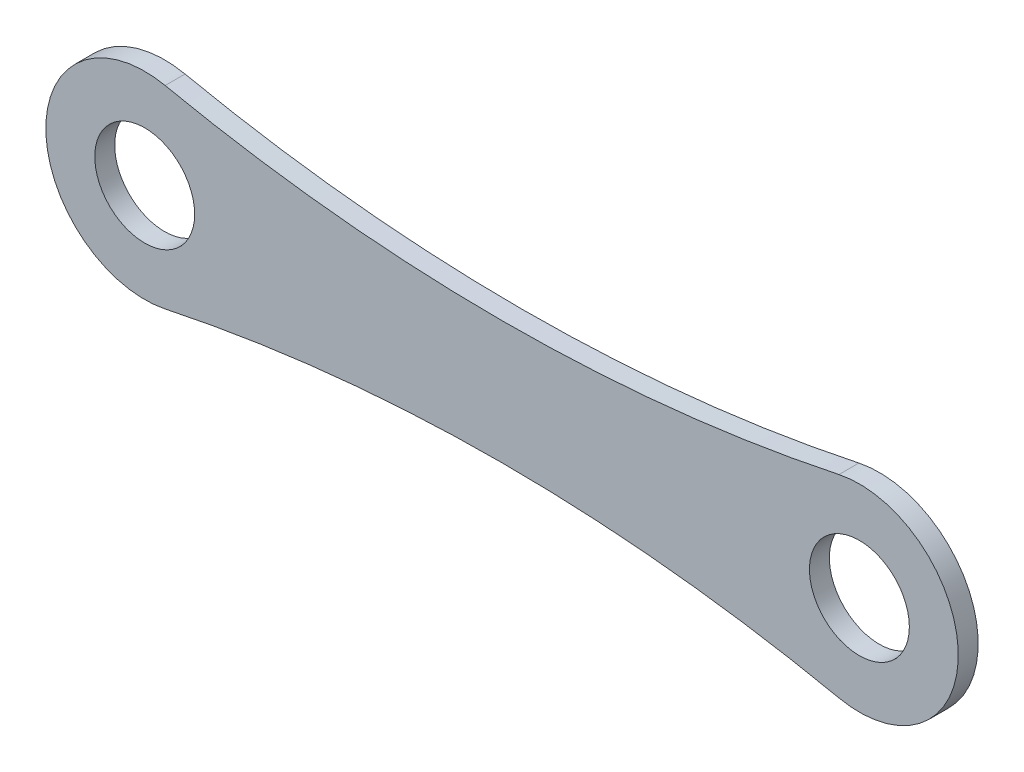
ISO-10303-21;
HEADER;
FILE_DESCRIPTION(('STEP AP214'),'2;1');
FILE_NAME('part.step','',(''),(''),'','','');
FILE_SCHEMA(('AUTOMOTIVE_DESIGN { 1 0 10303 214 1 1 1 1 }'));
ENDSEC;
DATA;
#1=APPLICATION_CONTEXT('core data for automotive mechanical design processes');
#2=APPLICATION_PROTOCOL_DEFINITION('international standard','automotive_design',2000,#1);
#3=PRODUCT_CONTEXT('',#1,'mechanical');
#4=PRODUCT('Part','Part','',(#3));
#5=PRODUCT_RELATED_PRODUCT_CATEGORY('part','',(#4));
#6=PRODUCT_DEFINITION_FORMATION('','',#4);
#7=PRODUCT_DEFINITION_CONTEXT('part definition',#1,'design');
#8=PRODUCT_DEFINITION('design','',#6,#7);
#9=PRODUCT_DEFINITION_SHAPE('','',#8);
#10=(LENGTH_UNIT() NAMED_UNIT(*) SI_UNIT(.MILLI.,.METRE.));
#11=(NAMED_UNIT(*) PLANE_ANGLE_UNIT() SI_UNIT($,.RADIAN.));
#12=(NAMED_UNIT(*) SI_UNIT($,.STERADIAN.) SOLID_ANGLE_UNIT());
#13=UNCERTAINTY_MEASURE_WITH_UNIT(LENGTH_MEASURE(1.E-05),#10,'distance_accuracy_value','');
#14=(GEOMETRIC_REPRESENTATION_CONTEXT(3) GLOBAL_UNCERTAINTY_ASSIGNED_CONTEXT((#13)) GLOBAL_UNIT_ASSIGNED_CONTEXT((#10,
#11,#12)) REPRESENTATION_CONTEXT('',''));
#15=CARTESIAN_POINT('',(0.,0.,0.));
#16=DIRECTION('',(0.,0.,1.));
#17=DIRECTION('',(1.,0.,0.));
#18=AXIS2_PLACEMENT_3D('',#15,#16,#17);
#19=CARTESIAN_POINT('',(0.,0.,-1.588));
#20=DIRECTION('',(0.,0.,-1.));
#21=DIRECTION('',(1.,0.,0.));
#22=AXIS2_PLACEMENT_3D('',#19,#20,#21);
#23=PLANE('',#22);
#24=CARTESIAN_POINT('',(0.,0.,-1.588));
#25=DIRECTION('',(0.,0.,1.));
#26=DIRECTION('',(1.,0.,0.));
#27=AXIS2_PLACEMENT_3D('',#24,#25,#26);
#28=CIRCLE('',#27,3.985);
#29=CARTESIAN_POINT('',(3.985,0.,-1.588));
#30=VERTEX_POINT('',#29);
#31=EDGE_CURVE('E188',#30,#30,#28,.T.);
#32=ORIENTED_EDGE('',*,*,#31,.T.);
#33=EDGE_LOOP('',(#32));
#34=FACE_BOUND('',#33,.T.);
#35=CARTESIAN_POINT('',(0.,0.,-1.588));
#36=DIRECTION('',(0.,0.,1.));
#37=DIRECTION('',(1.,0.,0.));
#38=AXIS2_PLACEMENT_3D('',#35,#36,#37);
#39=CIRCLE('',#38,7.89);
#40=CARTESIAN_POINT('',(-1.63132859525709,-7.7195120969072,-1.588));
#41=VERTEX_POINT('',#40);
#42=CARTESIAN_POINT('',(-1.63132859525709,7.71951209690719,-1.588));
#43=VERTEX_POINT('',#42);
#44=EDGE_CURVE('E191',#41,#43,#39,.T.);
#45=ORIENTED_EDGE('',*,*,#44,.F.);
#46=CARTESIAN_POINT('',(-28.51,-134.910459194237,-1.588));
#47=DIRECTION('',(0.,0.,1.));
#48=DIRECTION('',(1.,0.,0.));
#49=AXIS2_PLACEMENT_3D('',#46,#47,#48);
#50=CIRCLE('',#49,130.);
#51=CARTESIAN_POINT('',(-55.3886714047429,-7.71951209690719,-1.588));
#52=VERTEX_POINT('',#51);
#53=EDGE_CURVE('E199',#41,#52,#50,.T.);
#54=ORIENTED_EDGE('',*,*,#53,.T.);
#55=CARTESIAN_POINT('',(-57.02,0.,-1.588));
#56=DIRECTION('',(0.,0.,1.));
#57=DIRECTION('',(1.,0.,0.));
#58=AXIS2_PLACEMENT_3D('',#55,#56,#57);
#59=CIRCLE('',#58,7.89);
#60=CARTESIAN_POINT('',(-55.3886714047429,7.71951209690719,-1.588));
#61=VERTEX_POINT('',#60);
#62=EDGE_CURVE('E196',#61,#52,#59,.T.);
#63=ORIENTED_EDGE('',*,*,#62,.F.);
#64=CARTESIAN_POINT('',(-28.51,134.910459194237,-1.588));
#65=DIRECTION('',(0.,0.,1.));
#66=DIRECTION('',(1.,0.,0.));
#67=AXIS2_PLACEMENT_3D('',#64,#65,#66);
#68=CIRCLE('',#67,130.);
#69=EDGE_CURVE('E194',#43,#61,#68,.F.);
#70=ORIENTED_EDGE('',*,*,#69,.F.);
#71=EDGE_LOOP('',(#45,#54,#63,#70));
#72=FACE_BOUND('',#71,.T.);
#73=CARTESIAN_POINT('',(-57.02,0.,-1.588));
#74=DIRECTION('',(0.,0.,1.));
#75=DIRECTION('',(1.,0.,0.));
#76=AXIS2_PLACEMENT_3D('',#73,#74,#75);
#77=CIRCLE('',#76,3.985);
#78=CARTESIAN_POINT('',(-53.035,0.,-1.588));
#79=VERTEX_POINT('',#78);
#80=EDGE_CURVE('E202',#79,#79,#77,.T.);
#81=ORIENTED_EDGE('',*,*,#80,.T.);
#82=EDGE_LOOP('',(#81));
#83=FACE_BOUND('',#82,.T.);
#84=DIRECTION('',(-1.,0.,0.));
#85=VECTOR('',#84,1.);
#86=CARTESIAN_POINT('',(-47.8578537610848,-2.24163128163509,-1.588));
#87=LINE('',#86,#85);
#88=CARTESIAN_POINT('',(-47.8578537610848,-2.24163128163509,-1.588));
#89=VERTEX_POINT('',#88);
#90=CARTESIAN_POINT('',(-48.4860588892899,-2.24163128163509,-1.588));
#91=VERTEX_POINT('',#90);
#92=EDGE_CURVE('E174',#89,#91,#87,.T.);
#93=ORIENTED_EDGE('',*,*,#92,.F.);
#94=DIRECTION('',(0.,-1.,0.));
#95=VECTOR('',#94,1.);
#96=CARTESIAN_POINT('',(-47.8578537610848,-0.671118461122265,-1.588));
#97=LINE('',#96,#95);
#98=CARTESIAN_POINT('',(-47.8578537610848,-0.671118461122265,-1.588));
#99=VERTEX_POINT('',#98);
#100=EDGE_CURVE('E264',#99,#89,#97,.T.);
#101=ORIENTED_EDGE('',*,*,#100,.F.);
#102=DIRECTION('',(-1.,0.,0.));
#103=VECTOR('',#102,1.);
#104=CARTESIAN_POINT('',(-46.7809306841617,-0.671118461122265,-1.588));
#105=LINE('',#104,#103);
#106=CARTESIAN_POINT('',(-46.7809306841617,-0.671118461122265,-1.588));
#107=VERTEX_POINT('',#106);
#108=EDGE_CURVE('E267',#107,#99,#105,.T.);
#109=ORIENTED_EDGE('',*,*,#108,.F.);
#110=DIRECTION('',(0.,-1.,0.));
#111=VECTOR('',#110,1.);
#112=CARTESIAN_POINT('',(-46.7809306841617,-0.0429133329171365,-1.588));
#113=LINE('',#112,#111);
#114=CARTESIAN_POINT('',(-46.7809306841617,-0.0429133329171365,-1.588));
#115=VERTEX_POINT('',#114);
#116=EDGE_CURVE('E310',#115,#107,#113,.T.);
#117=ORIENTED_EDGE('',*,*,#116,.F.);
#118=DIRECTION('',(1.,0.,0.));
#119=VECTOR('',#118,1.);
#120=CARTESIAN_POINT('',(-47.8578537610848,-0.0429133329171365,-1.588));
#121=LINE('',#120,#119);
#122=CARTESIAN_POINT('',(-47.8578537610848,-0.0429133329171365,-1.588));
#123=VERTEX_POINT('',#122);
#124=EDGE_CURVE('E304',#123,#115,#121,.T.);
#125=ORIENTED_EDGE('',*,*,#124,.F.);
#126=DIRECTION('',(0.,-1.,0.));
#127=VECTOR('',#126,1.);
#128=CARTESIAN_POINT('',(-47.8578537610848,0.630163590159787,-1.588));
#129=LINE('',#128,#127);
#130=CARTESIAN_POINT('',(-47.8578537610848,0.630163590159787,-1.588));
#131=VERTEX_POINT('',#130);
#132=EDGE_CURVE('E302',#131,#123,#129,.T.);
#133=ORIENTED_EDGE('',*,*,#132,.F.);
#134=DIRECTION('',(-1.,0.,0.));
#135=VECTOR('',#134,1.);
#136=CARTESIAN_POINT('',(-46.7809306841617,0.630163590159787,-1.588));
#137=LINE('',#136,#135);
#138=CARTESIAN_POINT('',(-46.7809306841617,0.630163590159787,-1.588));
#139=VERTEX_POINT('',#138);
#140=EDGE_CURVE('E290',#139,#131,#137,.T.);
#141=ORIENTED_EDGE('',*,*,#140,.F.);
#142=DIRECTION('',(0.,-1.,0.));
#143=VECTOR('',#142,1.);
#144=CARTESIAN_POINT('',(-46.7809306841617,1.25836871836491,-1.588));
#145=LINE('',#144,#143);
#146=CARTESIAN_POINT('',(-46.7809306841617,1.25836871836491,-1.588));
#147=VERTEX_POINT('',#146);
#148=EDGE_CURVE('E296',#147,#139,#145,.T.);
#149=ORIENTED_EDGE('',*,*,#148,.F.);
#150=DIRECTION('',(1.,0.,0.));
#151=VECTOR('',#150,1.);
#152=CARTESIAN_POINT('',(-48.4860588892899,1.25836871836491,-1.588));
#153=LINE('',#152,#151);
#154=CARTESIAN_POINT('',(-48.4860588892899,1.25836871836491,-1.588));
#155=VERTEX_POINT('',#154);
#156=EDGE_CURVE('E298',#155,#147,#153,.T.);
#157=ORIENTED_EDGE('',*,*,#156,.F.);
#158=DIRECTION('',(0.,1.,0.));
#159=VECTOR('',#158,1.);
#160=CARTESIAN_POINT('',(-48.4860588892899,-2.24163128163509,-1.588));
#161=LINE('',#160,#159);
#162=EDGE_CURVE('E177',#91,#155,#161,.T.);
#163=ORIENTED_EDGE('',*,*,#162,.F.);
#164=EDGE_LOOP('',(#93,#101,#109,#117,#125,#133,#141,#149,#157,#163));
#165=FACE_BOUND('',#164,.T.);
#166=ADVANCED_FACE('F47',(#34,#72,#83,#165),#23,.T.);
#167=CARTESIAN_POINT('',(0.,0.,-1.588));
#168=DIRECTION('',(0.,0.,1.));
#169=DIRECTION('',(-1.,0.,0.));
#170=AXIS2_PLACEMENT_3D('',#167,#168,#169);
#171=CYLINDRICAL_SURFACE('',#170,7.89);
#172=CARTESIAN_POINT('',(0.,0.,0.));
#173=DIRECTION('',(0.,0.,1.));
#174=DIRECTION('',(1.,0.,0.));
#175=AXIS2_PLACEMENT_3D('',#172,#173,#174);
#176=CIRCLE('',#175,7.89);
#177=CARTESIAN_POINT('',(-1.63132859525709,-7.7195120969072,0.));
#178=VERTEX_POINT('',#177);
#179=CARTESIAN_POINT('',(-1.63132859525709,7.71951209690719,0.));
#180=VERTEX_POINT('',#179);
#181=EDGE_CURVE('E182',#178,#180,#176,.T.);
#182=ORIENTED_EDGE('',*,*,#181,.F.);
#183=DIRECTION('',(0.,0.,1.));
#184=VECTOR('',#183,1.);
#185=CARTESIAN_POINT('',(-1.63132859525709,-7.7195120969072,-1.588));
#186=LINE('',#185,#184);
#187=EDGE_CURVE('E71',#41,#178,#186,.T.);
#188=ORIENTED_EDGE('',*,*,#187,.F.);
#189=ORIENTED_EDGE('',*,*,#44,.T.);
#190=DIRECTION('',(0.,0.,1.));
#191=VECTOR('',#190,1.);
#192=CARTESIAN_POINT('',(-1.63132859525709,7.71951209690719,-1.588));
#193=LINE('',#192,#191);
#194=EDGE_CURVE('E11',#43,#180,#193,.T.);
#195=ORIENTED_EDGE('',*,*,#194,.T.);
#196=EDGE_LOOP('',(#182,#188,#189,#195));
#197=FACE_BOUND('',#196,.T.);
#198=ADVANCED_FACE('F223',(#197),#171,.T.);
#199=CARTESIAN_POINT('',(-28.51,134.910459194237,-1.588));
#200=DIRECTION('',(0.,0.,1.));
#201=DIRECTION('',(-1.,0.,0.));
#202=AXIS2_PLACEMENT_3D('',#199,#200,#201);
#203=CYLINDRICAL_SURFACE('',#202,130.);
#204=CARTESIAN_POINT('',(-28.51,134.910459194237,0.));
#205=DIRECTION('',(0.,0.,1.));
#206=DIRECTION('',(1.,0.,0.));
#207=AXIS2_PLACEMENT_3D('',#204,#205,#206);
#208=CIRCLE('',#207,130.);
#209=CARTESIAN_POINT('',(-55.3886714047429,7.71951209690719,0.));
#210=VERTEX_POINT('',#209);
#211=EDGE_CURVE('E206',#180,#210,#208,.F.);
#212=ORIENTED_EDGE('',*,*,#211,.F.);
#213=ORIENTED_EDGE('',*,*,#194,.F.);
#214=ORIENTED_EDGE('',*,*,#69,.T.);
#215=DIRECTION('',(0.,0.,1.));
#216=VECTOR('',#215,1.);
#217=CARTESIAN_POINT('',(-55.3886714047429,7.71951209690719,-1.588));
#218=LINE('',#217,#216);
#219=EDGE_CURVE('E55',#61,#210,#218,.T.);
#220=ORIENTED_EDGE('',*,*,#219,.T.);
#221=EDGE_LOOP('',(#212,#213,#214,#220));
#222=FACE_BOUND('',#221,.T.);
#223=ADVANCED_FACE('F218',(#222),#203,.F.);
#224=CARTESIAN_POINT('',(-57.02,0.,-1.588));
#225=DIRECTION('',(0.,0.,1.));
#226=DIRECTION('',(-1.,0.,0.));
#227=AXIS2_PLACEMENT_3D('',#224,#225,#226);
#228=CYLINDRICAL_SURFACE('',#227,7.89);
#229=CARTESIAN_POINT('',(-57.02,0.,0.));
#230=DIRECTION('',(0.,0.,1.));
#231=DIRECTION('',(1.,0.,0.));
#232=AXIS2_PLACEMENT_3D('',#229,#230,#231);
#233=CIRCLE('',#232,7.89);
#234=CARTESIAN_POINT('',(-55.3886714047429,-7.71951209690719,0.));
#235=VERTEX_POINT('',#234);
#236=EDGE_CURVE('E209',#210,#235,#233,.T.);
#237=ORIENTED_EDGE('',*,*,#236,.F.);
#238=ORIENTED_EDGE('',*,*,#219,.F.);
#239=ORIENTED_EDGE('',*,*,#62,.T.);
#240=DIRECTION('',(0.,0.,1.));
#241=VECTOR('',#240,1.);
#242=CARTESIAN_POINT('',(-55.3886714047429,-7.71951209690719,-1.588));
#243=LINE('',#242,#241);
#244=EDGE_CURVE('E215',#52,#235,#243,.T.);
#245=ORIENTED_EDGE('',*,*,#244,.T.);
#246=EDGE_LOOP('',(#237,#238,#239,#245));
#247=FACE_BOUND('',#246,.T.);
#248=ADVANCED_FACE('F227',(#247),#228,.T.);
#249=CARTESIAN_POINT('',(-28.51,-134.910459194237,-1.588));
#250=DIRECTION('',(0.,0.,1.));
#251=DIRECTION('',(-1.,0.,0.));
#252=AXIS2_PLACEMENT_3D('',#249,#250,#251);
#253=CYLINDRICAL_SURFACE('',#252,130.);
#254=CARTESIAN_POINT('',(-28.51,-134.910459194237,0.));
#255=DIRECTION('',(0.,0.,1.));
#256=DIRECTION('',(1.,0.,0.));
#257=AXIS2_PLACEMENT_3D('',#254,#255,#256);
#258=CIRCLE('',#257,130.);
#259=EDGE_CURVE('E93',#178,#235,#258,.T.);
#260=ORIENTED_EDGE('',*,*,#259,.T.);
#261=ORIENTED_EDGE('',*,*,#244,.F.);
#262=ORIENTED_EDGE('',*,*,#53,.F.);
#263=ORIENTED_EDGE('',*,*,#187,.T.);
#264=EDGE_LOOP('',(#260,#261,#262,#263));
#265=FACE_BOUND('',#264,.T.);
#266=ADVANCED_FACE('F229',(#265),#253,.F.);
#267=CARTESIAN_POINT('',(0.,0.,-1.588));
#268=DIRECTION('',(0.,0.,1.));
#269=DIRECTION('',(-1.,0.,0.));
#270=AXIS2_PLACEMENT_3D('',#267,#268,#269);
#271=CYLINDRICAL_SURFACE('',#270,3.985);
#272=ORIENTED_EDGE('',*,*,#31,.F.);
#273=EDGE_LOOP('',(#272));
#274=FACE_BOUND('',#273,.T.);
#275=CARTESIAN_POINT('',(0.,0.,0.));
#276=DIRECTION('',(0.,0.,1.));
#277=DIRECTION('',(1.,0.,0.));
#278=AXIS2_PLACEMENT_3D('',#275,#276,#277);
#279=CIRCLE('',#278,3.985);
#280=CARTESIAN_POINT('',(3.985,0.,0.));
#281=VERTEX_POINT('',#280);
#282=EDGE_CURVE('E179',#281,#281,#279,.T.);
#283=ORIENTED_EDGE('',*,*,#282,.T.);
#284=EDGE_LOOP('',(#283));
#285=FACE_BOUND('',#284,.T.);
#286=ADVANCED_FACE('F49',(#274,#285),#271,.F.);
#287=CARTESIAN_POINT('',(-57.02,0.,-1.588));
#288=DIRECTION('',(0.,0.,1.));
#289=DIRECTION('',(-1.,0.,0.));
#290=AXIS2_PLACEMENT_3D('',#287,#288,#289);
#291=CYLINDRICAL_SURFACE('',#290,3.985);
#292=ORIENTED_EDGE('',*,*,#80,.F.);
#293=EDGE_LOOP('',(#292));
#294=FACE_BOUND('',#293,.T.);
#295=CARTESIAN_POINT('',(-57.02,0.,0.));
#296=DIRECTION('',(0.,0.,1.));
#297=DIRECTION('',(1.,0.,0.));
#298=AXIS2_PLACEMENT_3D('',#295,#296,#297);
#299=CIRCLE('',#298,3.985);
#300=CARTESIAN_POINT('',(-53.035,0.,0.));
#301=VERTEX_POINT('',#300);
#302=EDGE_CURVE('E192',#301,#301,#299,.T.);
#303=ORIENTED_EDGE('',*,*,#302,.T.);
#304=EDGE_LOOP('',(#303));
#305=FACE_BOUND('',#304,.T.);
#306=ADVANCED_FACE('F236',(#294,#305),#291,.F.);
#307=CARTESIAN_POINT('',(0.,0.,0.));
#308=DIRECTION('',(0.,0.,-1.));
#309=DIRECTION('',(1.,0.,0.));
#310=AXIS2_PLACEMENT_3D('',#307,#308,#309);
#311=PLANE('',#310);
#312=ORIENTED_EDGE('',*,*,#282,.F.);
#313=EDGE_LOOP('',(#312));
#314=FACE_BOUND('',#313,.T.);
#315=ORIENTED_EDGE('',*,*,#181,.T.);
#316=ORIENTED_EDGE('',*,*,#211,.T.);
#317=ORIENTED_EDGE('',*,*,#236,.T.);
#318=ORIENTED_EDGE('',*,*,#259,.F.);
#319=EDGE_LOOP('',(#315,#316,#317,#318));
#320=FACE_BOUND('',#319,.T.);
#321=ORIENTED_EDGE('',*,*,#302,.F.);
#322=EDGE_LOOP('',(#321));
#323=FACE_BOUND('',#322,.T.);
#324=ADVANCED_FACE('F221',(#314,#320,#323),#311,.F.);
#325=CARTESIAN_POINT('',(-48.4860588892899,-2.24163128163509,-1.288));
#326=DIRECTION('',(1.,0.,0.));
#327=DIRECTION('',(0.,0.,1.));
#328=AXIS2_PLACEMENT_3D('',#325,#326,#327);
#329=PLANE('',#328);
#330=ORIENTED_EDGE('',*,*,#162,.T.);
#331=DIRECTION('',(0.,0.,-1.));
#332=VECTOR('',#331,1.);
#333=CARTESIAN_POINT('',(-48.4860588892899,1.25836871836491,-1.288));
#334=LINE('',#333,#332);
#335=CARTESIAN_POINT('',(-48.4860588892899,1.25836871836491,-1.288));
#336=VERTEX_POINT('',#335);
#337=EDGE_CURVE('E164',#336,#155,#334,.T.);
#338=ORIENTED_EDGE('',*,*,#337,.F.);
#339=DIRECTION('',(0.,1.,0.));
#340=VECTOR('',#339,1.);
#341=CARTESIAN_POINT('',(-48.4860588892899,-2.24163128163509,-1.288));
#342=LINE('',#341,#340);
#343=CARTESIAN_POINT('',(-48.4860588892899,-2.24163128163509,-1.288));
#344=VERTEX_POINT('',#343);
#345=EDGE_CURVE('E169',#344,#336,#342,.T.);
#346=ORIENTED_EDGE('',*,*,#345,.F.);
#347=DIRECTION('',(0.,0.,-1.));
#348=VECTOR('',#347,1.);
#349=CARTESIAN_POINT('',(-48.4860588892899,-2.24163128163509,-1.288));
#350=LINE('',#349,#348);
#351=EDGE_CURVE('E62',#344,#91,#350,.T.);
#352=ORIENTED_EDGE('',*,*,#351,.T.);
#353=EDGE_LOOP('',(#330,#338,#346,#352));
#354=FACE_BOUND('',#353,.T.);
#355=ADVANCED_FACE('F176',(#354),#329,.T.);
#356=CARTESIAN_POINT('',(-48.4860588892899,1.25836871836491,-1.288));
#357=DIRECTION('',(0.,-1.,0.));
#358=DIRECTION('',(0.,0.,1.));
#359=AXIS2_PLACEMENT_3D('',#356,#357,#358);
#360=PLANE('',#359);
#361=ORIENTED_EDGE('',*,*,#156,.T.);
#362=DIRECTION('',(0.,0.,-1.));
#363=VECTOR('',#362,1.);
#364=CARTESIAN_POINT('',(-46.7809306841617,1.25836871836491,-1.288));
#365=LINE('',#364,#363);
#366=CARTESIAN_POINT('',(-46.7809306841617,1.25836871836491,-1.288));
#367=VERTEX_POINT('',#366);
#368=EDGE_CURVE('E165',#367,#147,#365,.T.);
#369=ORIENTED_EDGE('',*,*,#368,.F.);
#370=DIRECTION('',(1.,0.,0.));
#371=VECTOR('',#370,1.);
#372=CARTESIAN_POINT('',(-48.4860588892899,1.25836871836491,-1.288));
#373=LINE('',#372,#371);
#374=EDGE_CURVE('E159',#336,#367,#373,.T.);
#375=ORIENTED_EDGE('',*,*,#374,.F.);
#376=ORIENTED_EDGE('',*,*,#337,.T.);
#377=EDGE_LOOP('',(#361,#369,#375,#376));
#378=FACE_BOUND('',#377,.T.);
#379=ADVANCED_FACE('F162',(#378),#360,.T.);
#380=CARTESIAN_POINT('',(-46.7809306841617,1.25836871836491,-1.288));
#381=DIRECTION('',(-1.,0.,0.));
#382=DIRECTION('',(0.,0.,-1.));
#383=AXIS2_PLACEMENT_3D('',#380,#381,#382);
#384=PLANE('',#383);
#385=ORIENTED_EDGE('',*,*,#148,.T.);
#386=DIRECTION('',(0.,0.,-1.));
#387=VECTOR('',#386,1.);
#388=CARTESIAN_POINT('',(-46.7809306841617,0.630163590159787,-1.288));
#389=LINE('',#388,#387);
#390=CARTESIAN_POINT('',(-46.7809306841617,0.630163590159787,-1.288));
#391=VERTEX_POINT('',#390);
#392=EDGE_CURVE('E184',#391,#139,#389,.T.);
#393=ORIENTED_EDGE('',*,*,#392,.F.);
#394=DIRECTION('',(0.,-1.,0.));
#395=VECTOR('',#394,1.);
#396=CARTESIAN_POINT('',(-46.7809306841617,1.25836871836491,-1.288));
#397=LINE('',#396,#395);
#398=EDGE_CURVE('E168',#367,#391,#397,.T.);
#399=ORIENTED_EDGE('',*,*,#398,.F.);
#400=ORIENTED_EDGE('',*,*,#368,.T.);
#401=EDGE_LOOP('',(#385,#393,#399,#400));
#402=FACE_BOUND('',#401,.T.);
#403=ADVANCED_FACE('F297',(#402),#384,.T.);
#404=CARTESIAN_POINT('',(-46.7809306841617,0.630163590159787,-1.288));
#405=DIRECTION('',(0.,1.,0.));
#406=DIRECTION('',(0.,0.,-1.));
#407=AXIS2_PLACEMENT_3D('',#404,#405,#406);
#408=PLANE('',#407);
#409=ORIENTED_EDGE('',*,*,#140,.T.);
#410=DIRECTION('',(0.,0.,-1.));
#411=VECTOR('',#410,1.);
#412=CARTESIAN_POINT('',(-47.8578537610848,0.630163590159787,-1.288));
#413=LINE('',#412,#411);
#414=CARTESIAN_POINT('',(-47.8578537610848,0.630163590159787,-1.288));
#415=VERTEX_POINT('',#414);
#416=EDGE_CURVE('E282',#415,#131,#413,.T.);
#417=ORIENTED_EDGE('',*,*,#416,.F.);
#418=DIRECTION('',(-1.,0.,0.));
#419=VECTOR('',#418,1.);
#420=CARTESIAN_POINT('',(-46.7809306841617,0.630163590159787,-1.288));
#421=LINE('',#420,#419);
#422=EDGE_CURVE('E293',#391,#415,#421,.T.);
#423=ORIENTED_EDGE('',*,*,#422,.F.);
#424=ORIENTED_EDGE('',*,*,#392,.T.);
#425=EDGE_LOOP('',(#409,#417,#423,#424));
#426=FACE_BOUND('',#425,.T.);
#427=ADVANCED_FACE('F287',(#426),#408,.T.);
#428=CARTESIAN_POINT('',(-47.8578537610848,0.630163590159787,-1.288));
#429=DIRECTION('',(-1.,0.,0.));
#430=DIRECTION('',(0.,0.,-1.));
#431=AXIS2_PLACEMENT_3D('',#428,#429,#430);
#432=PLANE('',#431);
#433=ORIENTED_EDGE('',*,*,#132,.T.);
#434=DIRECTION('',(0.,0.,-1.));
#435=VECTOR('',#434,1.);
#436=CARTESIAN_POINT('',(-47.8578537610848,-0.0429133329171365,-1.288));
#437=LINE('',#436,#435);
#438=CARTESIAN_POINT('',(-47.8578537610848,-0.0429133329171365,-1.288));
#439=VERTEX_POINT('',#438);
#440=EDGE_CURVE('E280',#439,#123,#437,.T.);
#441=ORIENTED_EDGE('',*,*,#440,.F.);
#442=DIRECTION('',(0.,-1.,0.));
#443=VECTOR('',#442,1.);
#444=CARTESIAN_POINT('',(-47.8578537610848,0.630163590159787,-1.288));
#445=LINE('',#444,#443);
#446=EDGE_CURVE('E331',#415,#439,#445,.T.);
#447=ORIENTED_EDGE('',*,*,#446,.F.);
#448=ORIENTED_EDGE('',*,*,#416,.T.);
#449=EDGE_LOOP('',(#433,#441,#447,#448));
#450=FACE_BOUND('',#449,.T.);
#451=ADVANCED_FACE('F330',(#450),#432,.T.);
#452=CARTESIAN_POINT('',(-47.8578537610848,-0.0429133329171365,-1.288));
#453=DIRECTION('',(0.,-1.,0.));
#454=DIRECTION('',(0.,0.,1.));
#455=AXIS2_PLACEMENT_3D('',#452,#453,#454);
#456=PLANE('',#455);
#457=ORIENTED_EDGE('',*,*,#124,.T.);
#458=DIRECTION('',(0.,0.,-1.));
#459=VECTOR('',#458,1.);
#460=CARTESIAN_POINT('',(-46.7809306841617,-0.0429133329171365,-1.288));
#461=LINE('',#460,#459);
#462=CARTESIAN_POINT('',(-46.7809306841617,-0.0429133329171365,-1.288));
#463=VERTEX_POINT('',#462);
#464=EDGE_CURVE('E278',#463,#115,#461,.T.);
#465=ORIENTED_EDGE('',*,*,#464,.F.);
#466=DIRECTION('',(1.,0.,0.));
#467=VECTOR('',#466,1.);
#468=CARTESIAN_POINT('',(-47.8578537610848,-0.0429133329171365,-1.288));
#469=LINE('',#468,#467);
#470=EDGE_CURVE('E327',#439,#463,#469,.T.);
#471=ORIENTED_EDGE('',*,*,#470,.F.);
#472=ORIENTED_EDGE('',*,*,#440,.T.);
#473=EDGE_LOOP('',(#457,#465,#471,#472));
#474=FACE_BOUND('',#473,.T.);
#475=ADVANCED_FACE('F325',(#474),#456,.T.);
#476=CARTESIAN_POINT('',(-46.7809306841617,-0.0429133329171365,-1.288));
#477=DIRECTION('',(-1.,0.,0.));
#478=DIRECTION('',(0.,0.,-1.));
#479=AXIS2_PLACEMENT_3D('',#476,#477,#478);
#480=PLANE('',#479);
#481=ORIENTED_EDGE('',*,*,#116,.T.);
#482=DIRECTION('',(0.,0.,-1.));
#483=VECTOR('',#482,1.);
#484=CARTESIAN_POINT('',(-46.7809306841617,-0.671118461122265,-1.288));
#485=LINE('',#484,#483);
#486=CARTESIAN_POINT('',(-46.7809306841617,-0.671118461122265,-1.288));
#487=VERTEX_POINT('',#486);
#488=EDGE_CURVE('E276',#487,#107,#485,.T.);
#489=ORIENTED_EDGE('',*,*,#488,.F.);
#490=DIRECTION('',(0.,-1.,0.));
#491=VECTOR('',#490,1.);
#492=CARTESIAN_POINT('',(-46.7809306841617,-0.0429133329171365,-1.288));
#493=LINE('',#492,#491);
#494=EDGE_CURVE('E322',#463,#487,#493,.T.);
#495=ORIENTED_EDGE('',*,*,#494,.F.);
#496=ORIENTED_EDGE('',*,*,#464,.T.);
#497=EDGE_LOOP('',(#481,#489,#495,#496));
#498=FACE_BOUND('',#497,.T.);
#499=ADVANCED_FACE('F319',(#498),#480,.T.);
#500=CARTESIAN_POINT('',(-46.7809306841617,-0.671118461122265,-1.288));
#501=DIRECTION('',(0.,1.,0.));
#502=DIRECTION('',(0.,0.,-1.));
#503=AXIS2_PLACEMENT_3D('',#500,#501,#502);
#504=PLANE('',#503);
#505=ORIENTED_EDGE('',*,*,#108,.T.);
#506=DIRECTION('',(0.,0.,-1.));
#507=VECTOR('',#506,1.);
#508=CARTESIAN_POINT('',(-47.8578537610848,-0.671118461122265,-1.288));
#509=LINE('',#508,#507);
#510=CARTESIAN_POINT('',(-47.8578537610848,-0.671118461122265,-1.288));
#511=VERTEX_POINT('',#510);
#512=EDGE_CURVE('E274',#511,#99,#509,.T.);
#513=ORIENTED_EDGE('',*,*,#512,.F.);
#514=DIRECTION('',(-1.,0.,0.));
#515=VECTOR('',#514,1.);
#516=CARTESIAN_POINT('',(-46.7809306841617,-0.671118461122265,-1.288));
#517=LINE('',#516,#515);
#518=EDGE_CURVE('E338',#487,#511,#517,.T.);
#519=ORIENTED_EDGE('',*,*,#518,.F.);
#520=ORIENTED_EDGE('',*,*,#488,.T.);
#521=EDGE_LOOP('',(#505,#513,#519,#520));
#522=FACE_BOUND('',#521,.T.);
#523=ADVANCED_FACE('F315',(#522),#504,.T.);
#524=CARTESIAN_POINT('',(-47.8578537610848,-0.671118461122265,-1.288));
#525=DIRECTION('',(-1.,0.,0.));
#526=DIRECTION('',(0.,0.,-1.));
#527=AXIS2_PLACEMENT_3D('',#524,#525,#526);
#528=PLANE('',#527);
#529=ORIENTED_EDGE('',*,*,#100,.T.);
#530=DIRECTION('',(0.,0.,-1.));
#531=VECTOR('',#530,1.);
#532=CARTESIAN_POINT('',(-47.8578537610848,-2.24163128163509,-1.288));
#533=LINE('',#532,#531);
#534=CARTESIAN_POINT('',(-47.8578537610848,-2.24163128163509,-1.288));
#535=VERTEX_POINT('',#534);
#536=EDGE_CURVE('E272',#535,#89,#533,.T.);
#537=ORIENTED_EDGE('',*,*,#536,.F.);
#538=DIRECTION('',(0.,-1.,0.));
#539=VECTOR('',#538,1.);
#540=CARTESIAN_POINT('',(-47.8578537610848,-0.671118461122265,-1.288));
#541=LINE('',#540,#539);
#542=EDGE_CURVE('E341',#511,#535,#541,.T.);
#543=ORIENTED_EDGE('',*,*,#542,.F.);
#544=ORIENTED_EDGE('',*,*,#512,.T.);
#545=EDGE_LOOP('',(#529,#537,#543,#544));
#546=FACE_BOUND('',#545,.T.);
#547=ADVANCED_FACE('F346',(#546),#528,.T.);
#548=CARTESIAN_POINT('',(-47.8578537610848,-2.24163128163509,-1.288));
#549=DIRECTION('',(0.,1.,0.));
#550=DIRECTION('',(0.,0.,-1.));
#551=AXIS2_PLACEMENT_3D('',#548,#549,#550);
#552=PLANE('',#551);
#553=ORIENTED_EDGE('',*,*,#92,.T.);
#554=ORIENTED_EDGE('',*,*,#351,.F.);
#555=DIRECTION('',(-1.,0.,0.));
#556=VECTOR('',#555,1.);
#557=CARTESIAN_POINT('',(-47.8578537610848,-2.24163128163509,-1.288));
#558=LINE('',#557,#556);
#559=EDGE_CURVE('E173',#535,#344,#558,.T.);
#560=ORIENTED_EDGE('',*,*,#559,.F.);
#561=ORIENTED_EDGE('',*,*,#536,.T.);
#562=EDGE_LOOP('',(#553,#554,#560,#561));
#563=FACE_BOUND('',#562,.T.);
#564=ADVANCED_FACE('F347',(#563),#552,.T.);
#565=CARTESIAN_POINT('',(0.,0.,-1.288));
#566=DIRECTION('',(0.,0.,1.));
#567=DIRECTION('',(-1.,0.,0.));
#568=AXIS2_PLACEMENT_3D('',#565,#566,#567);
#569=PLANE('',#568);
#570=ORIENTED_EDGE('',*,*,#345,.T.);
#571=ORIENTED_EDGE('',*,*,#374,.T.);
#572=ORIENTED_EDGE('',*,*,#398,.T.);
#573=ORIENTED_EDGE('',*,*,#422,.T.);
#574=ORIENTED_EDGE('',*,*,#446,.T.);
#575=ORIENTED_EDGE('',*,*,#470,.T.);
#576=ORIENTED_EDGE('',*,*,#494,.T.);
#577=ORIENTED_EDGE('',*,*,#518,.T.);
#578=ORIENTED_EDGE('',*,*,#542,.T.);
#579=ORIENTED_EDGE('',*,*,#559,.T.);
#580=EDGE_LOOP('',(#570,#571,#572,#573,#574,#575,#576,#577,#578,#579));
#581=FACE_BOUND('',#580,.T.);
#582=ADVANCED_FACE('F171',(#581),#569,.F.);
#583=CLOSED_SHELL('',(#166,#198,#223,#248,#266,#286,#306,#324,#355,#379,#403,#427,#451,#475,
#499,#523,#547,#564,#582));
#584=MANIFOLD_SOLID_BREP('B2',#583);
#585=ADVANCED_BREP_SHAPE_REPRESENTATION('',(#18,#584),#14);
#586=SHAPE_DEFINITION_REPRESENTATION(#9,#585);
ENDSEC;
END-ISO-10303-21;
